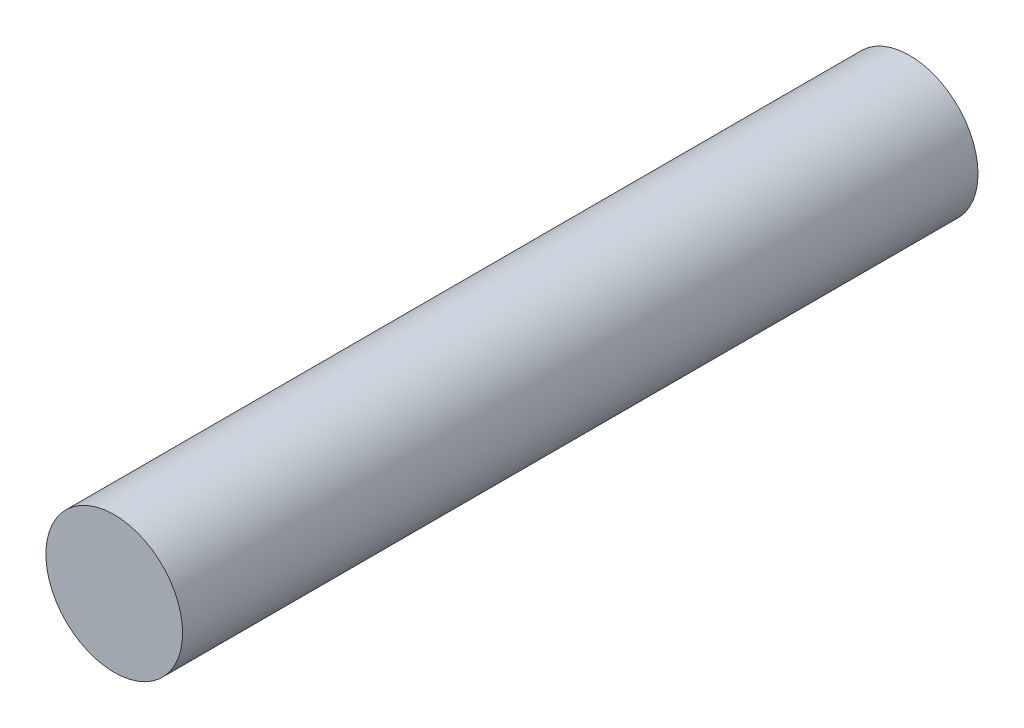
ISO-10303-21;
HEADER;
FILE_DESCRIPTION(('STEP AP214'),'2;1');
FILE_NAME('part.step','',(''),(''),'','','');
FILE_SCHEMA(('AUTOMOTIVE_DESIGN { 1 0 10303 214 1 1 1 1 }'));
ENDSEC;
DATA;
#1=APPLICATION_CONTEXT('core data for automotive mechanical design processes');
#2=APPLICATION_PROTOCOL_DEFINITION('international standard','automotive_design',2000,#1);
#3=PRODUCT_CONTEXT('',#1,'mechanical');
#4=PRODUCT('Part','Part','',(#3));
#5=PRODUCT_RELATED_PRODUCT_CATEGORY('part','',(#4));
#6=PRODUCT_DEFINITION_FORMATION('','',#4);
#7=PRODUCT_DEFINITION_CONTEXT('part definition',#1,'design');
#8=PRODUCT_DEFINITION('design','',#6,#7);
#9=PRODUCT_DEFINITION_SHAPE('','',#8);
#10=(LENGTH_UNIT() NAMED_UNIT(*) SI_UNIT(.MILLI.,.METRE.));
#11=(NAMED_UNIT(*) PLANE_ANGLE_UNIT() SI_UNIT($,.RADIAN.));
#12=(NAMED_UNIT(*) SI_UNIT($,.STERADIAN.) SOLID_ANGLE_UNIT());
#13=UNCERTAINTY_MEASURE_WITH_UNIT(LENGTH_MEASURE(1.E-05),#10,'distance_accuracy_value','');
#14=(GEOMETRIC_REPRESENTATION_CONTEXT(3) GLOBAL_UNCERTAINTY_ASSIGNED_CONTEXT((#13)) GLOBAL_UNIT_ASSIGNED_CONTEXT((#10,
#11,#12)) REPRESENTATION_CONTEXT('',''));
#15=CARTESIAN_POINT('',(0.,0.,0.));
#16=DIRECTION('',(0.,0.,1.));
#17=DIRECTION('',(1.,0.,0.));
#18=AXIS2_PLACEMENT_3D('',#15,#16,#17);
#19=CARTESIAN_POINT('',(0.,0.,3.20000122));
#20=DIRECTION('',(0.,0.,1.));
#21=DIRECTION('',(1.,0.,0.));
#22=AXIS2_PLACEMENT_3D('',#19,#20,#21);
#23=PLANE('',#22);
#24=CARTESIAN_POINT('',(0.,0.,3.20000122));
#25=DIRECTION('',(0.,0.,1.));
#26=DIRECTION('',(1.,0.,0.));
#27=AXIS2_PLACEMENT_3D('',#24,#25,#26);
#28=CIRCLE('',#27,0.27500072);
#29=CARTESIAN_POINT('',(0.27500072,0.,3.20000122));
#30=VERTEX_POINT('',#29);
#31=EDGE_CURVE('E10',#30,#30,#28,.T.);
#32=ORIENTED_EDGE('',*,*,#31,.T.);
#33=EDGE_LOOP('',(#32));
#34=FACE_BOUND('',#33,.T.);
#35=ADVANCED_FACE('F15',(#34),#23,.T.);
#36=CARTESIAN_POINT('',(0.,0.,0.));
#37=DIRECTION('',(0.,0.,1.));
#38=DIRECTION('',(1.,0.,0.));
#39=AXIS2_PLACEMENT_3D('',#36,#37,#38);
#40=PLANE('',#39);
#41=CARTESIAN_POINT('',(0.,0.,0.));
#42=DIRECTION('',(0.,0.,1.));
#43=DIRECTION('',(1.,0.,0.));
#44=AXIS2_PLACEMENT_3D('',#41,#42,#43);
#45=CIRCLE('',#44,0.27500072);
#46=CARTESIAN_POINT('',(0.27500072,0.,0.));
#47=VERTEX_POINT('',#46);
#48=EDGE_CURVE('E22',#47,#47,#45,.T.);
#49=ORIENTED_EDGE('',*,*,#48,.F.);
#50=EDGE_LOOP('',(#49));
#51=FACE_BOUND('',#50,.T.);
#52=ADVANCED_FACE('F37',(#51),#40,.F.);
#53=CARTESIAN_POINT('',(0.,0.,0.));
#54=DIRECTION('',(0.,0.,-1.));
#55=DIRECTION('',(1.,0.,0.));
#56=AXIS2_PLACEMENT_3D('',#53,#54,#55);
#57=CYLINDRICAL_SURFACE('',#56,0.27500072);
#58=ORIENTED_EDGE('',*,*,#31,.F.);
#59=EDGE_LOOP('',(#58));
#60=FACE_BOUND('',#59,.T.);
#61=ORIENTED_EDGE('',*,*,#48,.T.);
#62=EDGE_LOOP('',(#61));
#63=FACE_BOUND('',#62,.T.);
#64=ADVANCED_FACE('F35',(#60,#63),#57,.T.);
#65=CLOSED_SHELL('',(#35,#52,#64));
#66=MANIFOLD_SOLID_BREP('B1',#65);
#67=ADVANCED_BREP_SHAPE_REPRESENTATION('',(#18,#66),#14);
#68=SHAPE_DEFINITION_REPRESENTATION(#9,#67);
ENDSEC;
END-ISO-10303-21;
